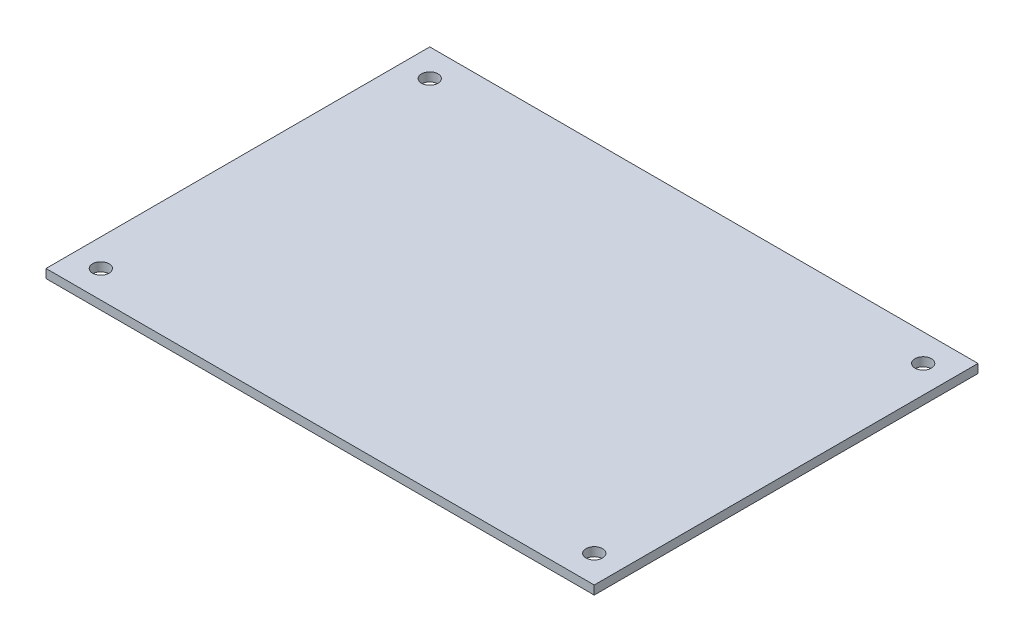
ISO-10303-21;
HEADER;
FILE_DESCRIPTION(('STEP AP214'),'2;1');
FILE_NAME('part.step','',(''),(''),'','','');
FILE_SCHEMA(('AUTOMOTIVE_DESIGN { 1 0 10303 214 1 1 1 1 }'));
ENDSEC;
DATA;
#1=APPLICATION_CONTEXT('core data for automotive mechanical design processes');
#2=APPLICATION_PROTOCOL_DEFINITION('international standard','automotive_design',2000,#1);
#3=PRODUCT_CONTEXT('',#1,'mechanical');
#4=PRODUCT('Part','Part','',(#3));
#5=PRODUCT_RELATED_PRODUCT_CATEGORY('part','',(#4));
#6=PRODUCT_DEFINITION_FORMATION('','',#4);
#7=PRODUCT_DEFINITION_CONTEXT('part definition',#1,'design');
#8=PRODUCT_DEFINITION('design','',#6,#7);
#9=PRODUCT_DEFINITION_SHAPE('','',#8);
#10=(LENGTH_UNIT() NAMED_UNIT(*) SI_UNIT(.MILLI.,.METRE.));
#11=(NAMED_UNIT(*) PLANE_ANGLE_UNIT() SI_UNIT($,.RADIAN.));
#12=(NAMED_UNIT(*) SI_UNIT($,.STERADIAN.) SOLID_ANGLE_UNIT());
#13=UNCERTAINTY_MEASURE_WITH_UNIT(LENGTH_MEASURE(1.E-05),#10,'distance_accuracy_value','');
#14=(GEOMETRIC_REPRESENTATION_CONTEXT(3) GLOBAL_UNCERTAINTY_ASSIGNED_CONTEXT((#13)) GLOBAL_UNIT_ASSIGNED_CONTEXT((#10,
#11,#12)) REPRESENTATION_CONTEXT('',''));
#15=CARTESIAN_POINT('',(0.,0.,0.));
#16=DIRECTION('',(0.,0.,1.));
#17=DIRECTION('',(1.,0.,0.));
#18=AXIS2_PLACEMENT_3D('',#15,#16,#17);
#19=CARTESIAN_POINT('',(0.,1.6,0.));
#20=DIRECTION('',(-1.,0.,0.));
#21=DIRECTION('',(0.,0.,1.));
#22=AXIS2_PLACEMENT_3D('',#19,#20,#21);
#23=PLANE('',#22);
#24=DIRECTION('',(0.,0.,-1.));
#25=VECTOR('',#24,1.);
#26=CARTESIAN_POINT('',(0.,0.,0.));
#27=LINE('',#26,#25);
#28=CARTESIAN_POINT('',(0.,0.,0.));
#29=VERTEX_POINT('',#28);
#30=CARTESIAN_POINT('',(0.,0.,-70.));
#31=VERTEX_POINT('',#30);
#32=EDGE_CURVE('E106',#29,#31,#27,.T.);
#33=ORIENTED_EDGE('',*,*,#32,.T.);
#34=DIRECTION('',(0.,-1.,0.));
#35=VECTOR('',#34,1.);
#36=CARTESIAN_POINT('',(0.,1.6,-70.));
#37=LINE('',#36,#35);
#38=CARTESIAN_POINT('',(0.,1.6,-70.));
#39=VERTEX_POINT('',#38);
#40=EDGE_CURVE('E11',#39,#31,#37,.T.);
#41=ORIENTED_EDGE('',*,*,#40,.F.);
#42=DIRECTION('',(0.,0.,-1.));
#43=VECTOR('',#42,1.);
#44=CARTESIAN_POINT('',(0.,1.6,0.));
#45=LINE('',#44,#43);
#46=CARTESIAN_POINT('',(0.,1.6,0.));
#47=VERTEX_POINT('',#46);
#48=EDGE_CURVE('E90',#47,#39,#45,.T.);
#49=ORIENTED_EDGE('',*,*,#48,.F.);
#50=DIRECTION('',(0.,-1.,0.));
#51=VECTOR('',#50,1.);
#52=CARTESIAN_POINT('',(0.,1.6,0.));
#53=LINE('',#52,#51);
#54=EDGE_CURVE('E102',#47,#29,#53,.T.);
#55=ORIENTED_EDGE('',*,*,#54,.T.);
#56=EDGE_LOOP('',(#33,#41,#49,#55));
#57=FACE_BOUND('',#56,.T.);
#58=ADVANCED_FACE('F38',(#57),#23,.F.);
#59=CARTESIAN_POINT('',(-100.,1.6,-70.));
#60=DIRECTION('',(0.,0.,1.));
#61=DIRECTION('',(1.,0.,0.));
#62=AXIS2_PLACEMENT_3D('',#59,#60,#61);
#63=PLANE('',#62);
#64=DIRECTION('',(-1.,0.,0.));
#65=VECTOR('',#64,1.);
#66=CARTESIAN_POINT('',(-100.,0.,-70.));
#67=LINE('',#66,#65);
#68=CARTESIAN_POINT('',(-100.,0.,-70.));
#69=VERTEX_POINT('',#68);
#70=EDGE_CURVE('E95',#31,#69,#67,.T.);
#71=ORIENTED_EDGE('',*,*,#70,.T.);
#72=DIRECTION('',(0.,-1.,0.));
#73=VECTOR('',#72,1.);
#74=CARTESIAN_POINT('',(-100.,1.6,-70.));
#75=LINE('',#74,#73);
#76=CARTESIAN_POINT('',(-100.,1.6,-70.));
#77=VERTEX_POINT('',#76);
#78=EDGE_CURVE('E47',#77,#69,#75,.T.);
#79=ORIENTED_EDGE('',*,*,#78,.F.);
#80=DIRECTION('',(-1.,0.,0.));
#81=VECTOR('',#80,1.);
#82=CARTESIAN_POINT('',(-100.,1.6,-70.));
#83=LINE('',#82,#81);
#84=EDGE_CURVE('E85',#39,#77,#83,.T.);
#85=ORIENTED_EDGE('',*,*,#84,.F.);
#86=ORIENTED_EDGE('',*,*,#40,.T.);
#87=EDGE_LOOP('',(#71,#79,#85,#86));
#88=FACE_BOUND('',#87,.T.);
#89=ADVANCED_FACE('F94',(#88),#63,.F.);
#90=CARTESIAN_POINT('',(-100.,1.6,0.));
#91=DIRECTION('',(1.,0.,0.));
#92=DIRECTION('',(0.,0.,-1.));
#93=AXIS2_PLACEMENT_3D('',#90,#91,#92);
#94=PLANE('',#93);
#95=DIRECTION('',(0.,0.,1.));
#96=VECTOR('',#95,1.);
#97=CARTESIAN_POINT('',(-100.,0.,0.));
#98=LINE('',#97,#96);
#99=CARTESIAN_POINT('',(-100.,0.,0.));
#100=VERTEX_POINT('',#99);
#101=EDGE_CURVE('E72',#69,#100,#98,.T.);
#102=ORIENTED_EDGE('',*,*,#101,.T.);
#103=DIRECTION('',(0.,-1.,0.));
#104=VECTOR('',#103,1.);
#105=CARTESIAN_POINT('',(-100.,1.6,0.));
#106=LINE('',#105,#104);
#107=CARTESIAN_POINT('',(-100.,1.6,0.));
#108=VERTEX_POINT('',#107);
#109=EDGE_CURVE('E97',#108,#100,#106,.T.);
#110=ORIENTED_EDGE('',*,*,#109,.F.);
#111=DIRECTION('',(0.,0.,1.));
#112=VECTOR('',#111,1.);
#113=CARTESIAN_POINT('',(-100.,1.6,0.));
#114=LINE('',#113,#112);
#115=EDGE_CURVE('E88',#77,#108,#114,.T.);
#116=ORIENTED_EDGE('',*,*,#115,.F.);
#117=ORIENTED_EDGE('',*,*,#78,.T.);
#118=EDGE_LOOP('',(#102,#110,#116,#117));
#119=FACE_BOUND('',#118,.T.);
#120=ADVANCED_FACE('F98',(#119),#94,.F.);
#121=CARTESIAN_POINT('',(0.,1.6,0.));
#122=DIRECTION('',(0.,0.,-1.));
#123=DIRECTION('',(-1.,0.,0.));
#124=AXIS2_PLACEMENT_3D('',#121,#122,#123);
#125=PLANE('',#124);
#126=DIRECTION('',(1.,0.,0.));
#127=VECTOR('',#126,1.);
#128=CARTESIAN_POINT('',(0.,0.,0.));
#129=LINE('',#128,#127);
#130=EDGE_CURVE('E78',#100,#29,#129,.T.);
#131=ORIENTED_EDGE('',*,*,#130,.T.);
#132=ORIENTED_EDGE('',*,*,#54,.F.);
#133=DIRECTION('',(1.,0.,0.));
#134=VECTOR('',#133,1.);
#135=CARTESIAN_POINT('',(0.,1.6,0.));
#136=LINE('',#135,#134);
#137=EDGE_CURVE('E55',#108,#47,#136,.T.);
#138=ORIENTED_EDGE('',*,*,#137,.F.);
#139=ORIENTED_EDGE('',*,*,#109,.T.);
#140=EDGE_LOOP('',(#131,#132,#138,#139));
#141=FACE_BOUND('',#140,.T.);
#142=ADVANCED_FACE('F120',(#141),#125,.F.);
#143=CARTESIAN_POINT('',(0.,1.6,0.));
#144=DIRECTION('',(0.,-1.,0.));
#145=DIRECTION('',(0.,0.,-1.));
#146=AXIS2_PLACEMENT_3D('',#143,#144,#145);
#147=PLANE('',#146);
#148=CARTESIAN_POINT('',(-5.,1.6,-65.));
#149=DIRECTION('',(0.,1.,0.));
#150=DIRECTION('',(0.,0.,-1.));
#151=AXIS2_PLACEMENT_3D('',#148,#149,#150);
#152=CIRCLE('',#151,1.5);
#153=CARTESIAN_POINT('',(-5.,1.6,-66.5));
#154=VERTEX_POINT('',#153);
#155=EDGE_CURVE('E135',#154,#154,#152,.T.);
#156=ORIENTED_EDGE('',*,*,#155,.F.);
#157=EDGE_LOOP('',(#156));
#158=FACE_BOUND('',#157,.T.);
#159=CARTESIAN_POINT('',(-4.99999999999999,1.6,-5.));
#160=DIRECTION('',(0.,1.,0.));
#161=DIRECTION('',(0.,0.,1.));
#162=AXIS2_PLACEMENT_3D('',#159,#160,#161);
#163=CIRCLE('',#162,1.5);
#164=CARTESIAN_POINT('',(-4.99999999999999,1.6,-3.5));
#165=VERTEX_POINT('',#164);
#166=EDGE_CURVE('E143',#165,#165,#163,.T.);
#167=ORIENTED_EDGE('',*,*,#166,.F.);
#168=EDGE_LOOP('',(#167));
#169=FACE_BOUND('',#168,.T.);
#170=CARTESIAN_POINT('',(-95.,1.6,-4.99999999999999));
#171=DIRECTION('',(0.,1.,0.));
#172=DIRECTION('',(0.,0.,-1.));
#173=AXIS2_PLACEMENT_3D('',#170,#171,#172);
#174=CIRCLE('',#173,1.5);
#175=CARTESIAN_POINT('',(-95.,1.6,-6.49999999999999));
#176=VERTEX_POINT('',#175);
#177=EDGE_CURVE('E151',#176,#176,#174,.T.);
#178=ORIENTED_EDGE('',*,*,#177,.F.);
#179=EDGE_LOOP('',(#178));
#180=FACE_BOUND('',#179,.T.);
#181=CARTESIAN_POINT('',(-95.,1.6,-65.));
#182=DIRECTION('',(0.,1.,0.));
#183=DIRECTION('',(0.,0.,1.));
#184=AXIS2_PLACEMENT_3D('',#181,#182,#183);
#185=CIRCLE('',#184,1.5);
#186=CARTESIAN_POINT('',(-95.,1.6,-63.5));
#187=VERTEX_POINT('',#186);
#188=EDGE_CURVE('E127',#187,#187,#185,.T.);
#189=ORIENTED_EDGE('',*,*,#188,.F.);
#190=EDGE_LOOP('',(#189));
#191=FACE_BOUND('',#190,.T.);
#192=ORIENTED_EDGE('',*,*,#48,.T.);
#193=ORIENTED_EDGE('',*,*,#84,.T.);
#194=ORIENTED_EDGE('',*,*,#115,.T.);
#195=ORIENTED_EDGE('',*,*,#137,.T.);
#196=EDGE_LOOP('',(#192,#193,#194,#195));
#197=FACE_BOUND('',#196,.T.);
#198=ADVANCED_FACE('F86',(#158,#169,#180,#191,#197),#147,.F.);
#199=CARTESIAN_POINT('',(0.,0.,0.));
#200=DIRECTION('',(0.,-1.,0.));
#201=DIRECTION('',(0.,0.,-1.));
#202=AXIS2_PLACEMENT_3D('',#199,#200,#201);
#203=PLANE('',#202);
#204=CARTESIAN_POINT('',(-5.,0.,-65.));
#205=DIRECTION('',(0.,1.,0.));
#206=DIRECTION('',(0.,0.,-1.));
#207=AXIS2_PLACEMENT_3D('',#204,#205,#206);
#208=CIRCLE('',#207,1.5);
#209=CARTESIAN_POINT('',(-5.,0.,-66.5));
#210=VERTEX_POINT('',#209);
#211=EDGE_CURVE('E139',#210,#210,#208,.T.);
#212=ORIENTED_EDGE('',*,*,#211,.T.);
#213=EDGE_LOOP('',(#212));
#214=FACE_BOUND('',#213,.T.);
#215=CARTESIAN_POINT('',(-4.99999999999999,0.,-5.));
#216=DIRECTION('',(0.,1.,0.));
#217=DIRECTION('',(0.,0.,1.));
#218=AXIS2_PLACEMENT_3D('',#215,#216,#217);
#219=CIRCLE('',#218,1.5);
#220=CARTESIAN_POINT('',(-4.99999999999999,0.,-3.5));
#221=VERTEX_POINT('',#220);
#222=EDGE_CURVE('E147',#221,#221,#219,.T.);
#223=ORIENTED_EDGE('',*,*,#222,.T.);
#224=EDGE_LOOP('',(#223));
#225=FACE_BOUND('',#224,.T.);
#226=CARTESIAN_POINT('',(-95.,0.,-4.99999999999999));
#227=DIRECTION('',(0.,1.,0.));
#228=DIRECTION('',(0.,0.,-1.));
#229=AXIS2_PLACEMENT_3D('',#226,#227,#228);
#230=CIRCLE('',#229,1.5);
#231=CARTESIAN_POINT('',(-95.,0.,-6.49999999999999));
#232=VERTEX_POINT('',#231);
#233=EDGE_CURVE('E131',#232,#232,#230,.T.);
#234=ORIENTED_EDGE('',*,*,#233,.T.);
#235=EDGE_LOOP('',(#234));
#236=FACE_BOUND('',#235,.T.);
#237=CARTESIAN_POINT('',(-95.,0.,-65.));
#238=DIRECTION('',(0.,1.,0.));
#239=DIRECTION('',(0.,0.,1.));
#240=AXIS2_PLACEMENT_3D('',#237,#238,#239);
#241=CIRCLE('',#240,1.5);
#242=CARTESIAN_POINT('',(-95.,0.,-63.5));
#243=VERTEX_POINT('',#242);
#244=EDGE_CURVE('E110',#243,#243,#241,.T.);
#245=ORIENTED_EDGE('',*,*,#244,.T.);
#246=EDGE_LOOP('',(#245));
#247=FACE_BOUND('',#246,.T.);
#248=ORIENTED_EDGE('',*,*,#32,.F.);
#249=ORIENTED_EDGE('',*,*,#130,.F.);
#250=ORIENTED_EDGE('',*,*,#101,.F.);
#251=ORIENTED_EDGE('',*,*,#70,.F.);
#252=EDGE_LOOP('',(#248,#249,#250,#251));
#253=FACE_BOUND('',#252,.T.);
#254=ADVANCED_FACE('F123',(#214,#225,#236,#247,#253),#203,.T.);
#255=CARTESIAN_POINT('',(-95.,0.,-65.));
#256=DIRECTION('',(0.,1.,0.));
#257=DIRECTION('',(0.,0.,1.));
#258=AXIS2_PLACEMENT_3D('',#255,#256,#257);
#259=CYLINDRICAL_SURFACE('',#258,1.5);
#260=ORIENTED_EDGE('',*,*,#244,.F.);
#261=EDGE_LOOP('',(#260));
#262=FACE_BOUND('',#261,.T.);
#263=ORIENTED_EDGE('',*,*,#188,.T.);
#264=EDGE_LOOP('',(#263));
#265=FACE_BOUND('',#264,.T.);
#266=ADVANCED_FACE('F165',(#262,#265),#259,.F.);
#267=CARTESIAN_POINT('',(-95.,0.,-4.99999999999999));
#268=DIRECTION('',(0.,1.,0.));
#269=DIRECTION('',(0.,0.,1.));
#270=AXIS2_PLACEMENT_3D('',#267,#268,#269);
#271=CYLINDRICAL_SURFACE('',#270,1.5);
#272=ORIENTED_EDGE('',*,*,#233,.F.);
#273=EDGE_LOOP('',(#272));
#274=FACE_BOUND('',#273,.T.);
#275=ORIENTED_EDGE('',*,*,#177,.T.);
#276=EDGE_LOOP('',(#275));
#277=FACE_BOUND('',#276,.T.);
#278=ADVANCED_FACE('F161',(#274,#277),#271,.F.);
#279=CARTESIAN_POINT('',(-4.99999999999999,0.,-5.));
#280=DIRECTION('',(0.,1.,0.));
#281=DIRECTION('',(0.,0.,1.));
#282=AXIS2_PLACEMENT_3D('',#279,#280,#281);
#283=CYLINDRICAL_SURFACE('',#282,1.5);
#284=ORIENTED_EDGE('',*,*,#222,.F.);
#285=EDGE_LOOP('',(#284));
#286=FACE_BOUND('',#285,.T.);
#287=ORIENTED_EDGE('',*,*,#166,.T.);
#288=EDGE_LOOP('',(#287));
#289=FACE_BOUND('',#288,.T.);
#290=ADVANCED_FACE('F164',(#286,#289),#283,.F.);
#291=CARTESIAN_POINT('',(-5.,0.,-65.));
#292=DIRECTION('',(0.,1.,0.));
#293=DIRECTION('',(0.,0.,1.));
#294=AXIS2_PLACEMENT_3D('',#291,#292,#293);
#295=CYLINDRICAL_SURFACE('',#294,1.5);
#296=ORIENTED_EDGE('',*,*,#211,.F.);
#297=EDGE_LOOP('',(#296));
#298=FACE_BOUND('',#297,.T.);
#299=ORIENTED_EDGE('',*,*,#155,.T.);
#300=EDGE_LOOP('',(#299));
#301=FACE_BOUND('',#300,.T.);
#302=ADVANCED_FACE('F228',(#298,#301),#295,.F.);
#303=CLOSED_SHELL('',(#58,#89,#120,#142,#198,#254,#266,#278,#290,#302));
#304=MANIFOLD_SOLID_BREP('B2',#303);
#305=ADVANCED_BREP_SHAPE_REPRESENTATION('',(#18,#304),#14);
#306=SHAPE_DEFINITION_REPRESENTATION(#9,#305);
ENDSEC;
END-ISO-10303-21;
